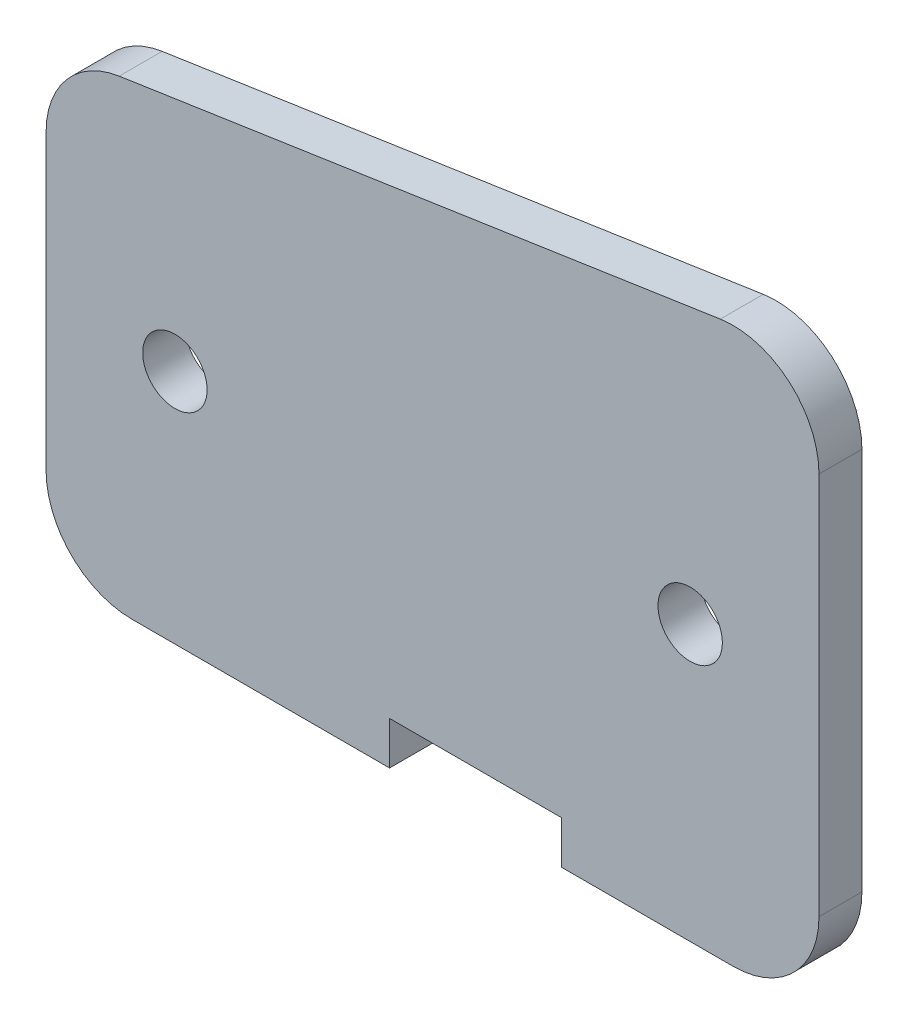
ISO-10303-21;
HEADER;
FILE_DESCRIPTION(('STEP AP214'),'2;1');
FILE_NAME('part.step','',(''),(''),'','','');
FILE_SCHEMA(('AUTOMOTIVE_DESIGN { 1 0 10303 214 1 1 1 1 }'));
ENDSEC;
DATA;
#1=APPLICATION_CONTEXT('core data for automotive mechanical design processes');
#2=APPLICATION_PROTOCOL_DEFINITION('international standard','automotive_design',2000,#1);
#3=PRODUCT_CONTEXT('',#1,'mechanical');
#4=PRODUCT('Part','Part','',(#3));
#5=PRODUCT_RELATED_PRODUCT_CATEGORY('part','',(#4));
#6=PRODUCT_DEFINITION_FORMATION('','',#4);
#7=PRODUCT_DEFINITION_CONTEXT('part definition',#1,'design');
#8=PRODUCT_DEFINITION('design','',#6,#7);
#9=PRODUCT_DEFINITION_SHAPE('','',#8);
#10=(LENGTH_UNIT() NAMED_UNIT(*) SI_UNIT(.MILLI.,.METRE.));
#11=(NAMED_UNIT(*) PLANE_ANGLE_UNIT() SI_UNIT($,.RADIAN.));
#12=(NAMED_UNIT(*) SI_UNIT($,.STERADIAN.) SOLID_ANGLE_UNIT());
#13=UNCERTAINTY_MEASURE_WITH_UNIT(LENGTH_MEASURE(1.E-05),#10,'distance_accuracy_value','');
#14=(GEOMETRIC_REPRESENTATION_CONTEXT(3) GLOBAL_UNCERTAINTY_ASSIGNED_CONTEXT((#13)) GLOBAL_UNIT_ASSIGNED_CONTEXT((#10,
#11,#12)) REPRESENTATION_CONTEXT('',''));
#15=CARTESIAN_POINT('',(0.,0.,0.));
#16=DIRECTION('',(0.,0.,1.));
#17=DIRECTION('',(1.,0.,0.));
#18=AXIS2_PLACEMENT_3D('',#15,#16,#17);
#19=CARTESIAN_POINT('',(-193.675,28.0277098778702,3.175));
#20=DIRECTION('',(0.,0.,-1.));
#21=DIRECTION('',(-1.,0.,0.));
#22=AXIS2_PLACEMENT_3D('',#19,#20,#21);
#23=PLANE('',#22);
#24=CARTESIAN_POINT('',(-193.675,28.0277098778702,3.175));
#25=DIRECTION('',(0.,0.,-1.));
#26=DIRECTION('',(-1.,0.,0.));
#27=AXIS2_PLACEMENT_3D('',#24,#25,#26);
#28=CIRCLE('',#27,6.35);
#29=CARTESIAN_POINT('',(-200.025,28.0277098778702,3.175));
#30=VERTEX_POINT('',#29);
#31=CARTESIAN_POINT('',(-194.616961876107,34.3074557185839,3.175));
#32=VERTEX_POINT('',#31);
#33=EDGE_CURVE('E264',#30,#32,#28,.T.);
#34=ORIENTED_EDGE('',*,*,#33,.F.);
#35=DIRECTION('',(0.,-1.,0.));
#36=VECTOR('',#35,1.);
#37=CARTESIAN_POINT('',(-200.025,28.0277098778702,3.175));
#38=LINE('',#37,#36);
#39=CARTESIAN_POINT('',(-200.025,6.35000000000002,3.175));
#40=VERTEX_POINT('',#39);
#41=EDGE_CURVE('E212',#30,#40,#38,.T.);
#42=ORIENTED_EDGE('',*,*,#41,.T.);
#43=CARTESIAN_POINT('',(-193.675,6.34999999999997,3.175));
#44=DIRECTION('',(0.,0.,1.));
#45=DIRECTION('',(1.,0.,0.));
#46=AXIS2_PLACEMENT_3D('',#43,#44,#45);
#47=CIRCLE('',#46,6.35);
#48=CARTESIAN_POINT('',(-193.675,0.,3.175));
#49=VERTEX_POINT('',#48);
#50=EDGE_CURVE('E206',#40,#49,#47,.T.);
#51=ORIENTED_EDGE('',*,*,#50,.T.);
#52=DIRECTION('',(-1.,0.,0.));
#53=VECTOR('',#52,1.);
#54=CARTESIAN_POINT('',(-174.625,0.,3.175));
#55=LINE('',#54,#53);
#56=CARTESIAN_POINT('',(-174.625,0.,3.175));
#57=VERTEX_POINT('',#56);
#58=EDGE_CURVE('E211',#57,#49,#55,.T.);
#59=ORIENTED_EDGE('',*,*,#58,.F.);
#60=DIRECTION('',(0.,1.,0.));
#61=VECTOR('',#60,1.);
#62=CARTESIAN_POINT('',(-174.625,0.,3.175));
#63=LINE('',#62,#61);
#64=CARTESIAN_POINT('',(-174.625,3.17499999999997,3.175));
#65=VERTEX_POINT('',#64);
#66=EDGE_CURVE('E227',#57,#65,#63,.T.);
#67=ORIENTED_EDGE('',*,*,#66,.T.);
#68=DIRECTION('',(1.,0.,0.));
#69=VECTOR('',#68,1.);
#70=CARTESIAN_POINT('',(-174.625,3.17499999999997,3.175));
#71=LINE('',#70,#69);
#72=CARTESIAN_POINT('',(-161.925,3.17499999999998,3.175));
#73=VERTEX_POINT('',#72);
#74=EDGE_CURVE('E229',#65,#73,#71,.T.);
#75=ORIENTED_EDGE('',*,*,#74,.T.);
#76=DIRECTION('',(0.,1.,0.));
#77=VECTOR('',#76,1.);
#78=CARTESIAN_POINT('',(-161.925,0.,3.175));
#79=LINE('',#78,#77);
#80=CARTESIAN_POINT('',(-161.925,0.,3.175));
#81=VERTEX_POINT('',#80);
#82=EDGE_CURVE('E298',#81,#73,#79,.T.);
#83=ORIENTED_EDGE('',*,*,#82,.F.);
#84=DIRECTION('',(-1.,0.,0.));
#85=VECTOR('',#84,1.);
#86=CARTESIAN_POINT('',(-149.225,0.,3.175));
#87=LINE('',#86,#85);
#88=CARTESIAN_POINT('',(-149.225,0.,3.175));
#89=VERTEX_POINT('',#88);
#90=EDGE_CURVE('E299',#89,#81,#87,.T.);
#91=ORIENTED_EDGE('',*,*,#90,.F.);
#92=CARTESIAN_POINT('',(-149.225,6.34999999999998,3.175));
#93=DIRECTION('',(0.,0.,-1.));
#94=DIRECTION('',(-1.,0.,0.));
#95=AXIS2_PLACEMENT_3D('',#92,#93,#94);
#96=CIRCLE('',#95,6.35);
#97=CARTESIAN_POINT('',(-142.875,6.35000000000002,3.175));
#98=VERTEX_POINT('',#97);
#99=EDGE_CURVE('E304',#98,#89,#96,.T.);
#100=ORIENTED_EDGE('',*,*,#99,.F.);
#101=DIRECTION('',(0.,-1.,0.));
#102=VECTOR('',#101,1.);
#103=CARTESIAN_POINT('',(-142.875,34.6952098778702,3.175));
#104=LINE('',#103,#102);
#105=CARTESIAN_POINT('',(-142.875,34.6952098778702,3.175));
#106=VERTEX_POINT('',#105);
#107=EDGE_CURVE('E307',#106,#98,#104,.T.);
#108=ORIENTED_EDGE('',*,*,#107,.F.);
#109=CARTESIAN_POINT('',(-149.225,34.6952098778702,3.175));
#110=DIRECTION('',(0.,0.,1.));
#111=DIRECTION('',(1.,0.,0.));
#112=AXIS2_PLACEMENT_3D('',#109,#110,#111);
#113=CIRCLE('',#112,6.35);
#114=CARTESIAN_POINT('',(-150.166961876107,40.9749557185839,3.175));
#115=VERTEX_POINT('',#114);
#116=EDGE_CURVE('E310',#106,#115,#113,.T.);
#117=ORIENTED_EDGE('',*,*,#116,.T.);
#118=DIRECTION('',(0.988936352868298,0.148340452930245,0.));
#119=VECTOR('',#118,1.);
#120=CARTESIAN_POINT('',(-194.616961876107,34.3074557185839,3.175));
#121=LINE('',#120,#119);
#122=EDGE_CURVE('E312',#32,#115,#121,.T.);
#123=ORIENTED_EDGE('',*,*,#122,.F.);
#124=EDGE_LOOP('',(#34,#42,#51,#59,#67,#75,#83,#91,#100,#108,#117,#123));
#125=FACE_BOUND('',#124,.T.);
#126=CARTESIAN_POINT('',(-152.4,20.3199999999996,3.175));
#127=DIRECTION('',(0.,0.,1.));
#128=DIRECTION('',(1.,0.,0.));
#129=AXIS2_PLACEMENT_3D('',#126,#127,#128);
#130=CIRCLE('',#129,2.38125000000001);
#131=CARTESIAN_POINT('',(-150.01875,20.3199999999996,3.175));
#132=VERTEX_POINT('',#131);
#133=EDGE_CURVE('E238',#132,#132,#130,.T.);
#134=ORIENTED_EDGE('',*,*,#133,.F.);
#135=EDGE_LOOP('',(#134));
#136=FACE_BOUND('',#135,.T.);
#137=CARTESIAN_POINT('',(-190.5,17.4624999999994,3.175));
#138=DIRECTION('',(0.,0.,1.));
#139=DIRECTION('',(1.,0.,0.));
#140=AXIS2_PLACEMENT_3D('',#137,#138,#139);
#141=CIRCLE('',#140,2.38125000000001);
#142=CARTESIAN_POINT('',(-188.11875,17.4624999999994,3.175));
#143=VERTEX_POINT('',#142);
#144=EDGE_CURVE('E318',#143,#143,#141,.T.);
#145=ORIENTED_EDGE('',*,*,#144,.F.);
#146=EDGE_LOOP('',(#145));
#147=FACE_BOUND('',#146,.T.);
#148=ADVANCED_FACE('F111',(#125,#136,#147),#23,.F.);
#149=CARTESIAN_POINT('',(-193.675,28.0277098778702,0.));
#150=DIRECTION('',(0.,0.,-1.));
#151=DIRECTION('',(-1.,0.,0.));
#152=AXIS2_PLACEMENT_3D('',#149,#150,#151);
#153=PLANE('',#152);
#154=CARTESIAN_POINT('',(-152.4,20.3199999999996,0.));
#155=DIRECTION('',(0.,0.,1.));
#156=DIRECTION('',(1.,0.,0.));
#157=AXIS2_PLACEMENT_3D('',#154,#155,#156);
#158=CIRCLE('',#157,2.38125000000001);
#159=CARTESIAN_POINT('',(-150.01875,20.3199999999996,0.));
#160=VERTEX_POINT('',#159);
#161=EDGE_CURVE('E315',#160,#160,#158,.T.);
#162=ORIENTED_EDGE('',*,*,#161,.T.);
#163=EDGE_LOOP('',(#162));
#164=FACE_BOUND('',#163,.T.);
#165=CARTESIAN_POINT('',(-193.675,28.0277098778702,0.));
#166=DIRECTION('',(0.,0.,-1.));
#167=DIRECTION('',(-1.,0.,0.));
#168=AXIS2_PLACEMENT_3D('',#165,#166,#167);
#169=CIRCLE('',#168,6.35);
#170=CARTESIAN_POINT('',(-200.025,28.0277098778702,0.));
#171=VERTEX_POINT('',#170);
#172=CARTESIAN_POINT('',(-194.616961876107,34.3074557185839,0.));
#173=VERTEX_POINT('',#172);
#174=EDGE_CURVE('E234',#171,#173,#169,.T.);
#175=ORIENTED_EDGE('',*,*,#174,.T.);
#176=DIRECTION('',(0.988936352868298,0.148340452930245,0.));
#177=VECTOR('',#176,1.);
#178=CARTESIAN_POINT('',(-194.616961876107,34.3074557185839,0.));
#179=LINE('',#178,#177);
#180=CARTESIAN_POINT('',(-150.166961876107,40.9749557185839,0.));
#181=VERTEX_POINT('',#180);
#182=EDGE_CURVE('E237',#173,#181,#179,.T.);
#183=ORIENTED_EDGE('',*,*,#182,.T.);
#184=CARTESIAN_POINT('',(-149.225,34.6952098778702,0.));
#185=DIRECTION('',(0.,0.,1.));
#186=DIRECTION('',(1.,0.,0.));
#187=AXIS2_PLACEMENT_3D('',#184,#185,#186);
#188=CIRCLE('',#187,6.35);
#189=CARTESIAN_POINT('',(-142.875,34.6952098778702,0.));
#190=VERTEX_POINT('',#189);
#191=EDGE_CURVE('E241',#190,#181,#188,.T.);
#192=ORIENTED_EDGE('',*,*,#191,.F.);
#193=DIRECTION('',(0.,-1.,0.));
#194=VECTOR('',#193,1.);
#195=CARTESIAN_POINT('',(-142.875,34.6952098778702,0.));
#196=LINE('',#195,#194);
#197=CARTESIAN_POINT('',(-142.875,6.35000000000002,0.));
#198=VERTEX_POINT('',#197);
#199=EDGE_CURVE('E244',#190,#198,#196,.T.);
#200=ORIENTED_EDGE('',*,*,#199,.T.);
#201=CARTESIAN_POINT('',(-149.225,6.34999999999998,0.));
#202=DIRECTION('',(0.,0.,-1.));
#203=DIRECTION('',(-1.,0.,0.));
#204=AXIS2_PLACEMENT_3D('',#201,#202,#203);
#205=CIRCLE('',#204,6.35);
#206=CARTESIAN_POINT('',(-149.225,0.,0.));
#207=VERTEX_POINT('',#206);
#208=EDGE_CURVE('E247',#198,#207,#205,.T.);
#209=ORIENTED_EDGE('',*,*,#208,.T.);
#210=DIRECTION('',(-1.,0.,0.));
#211=VECTOR('',#210,1.);
#212=CARTESIAN_POINT('',(-149.225,0.,0.));
#213=LINE('',#212,#211);
#214=CARTESIAN_POINT('',(-161.925,0.,0.));
#215=VERTEX_POINT('',#214);
#216=EDGE_CURVE('E250',#207,#215,#213,.T.);
#217=ORIENTED_EDGE('',*,*,#216,.T.);
#218=DIRECTION('',(0.,1.,0.));
#219=VECTOR('',#218,1.);
#220=CARTESIAN_POINT('',(-161.925,0.,0.));
#221=LINE('',#220,#219);
#222=CARTESIAN_POINT('',(-161.925,3.17499999999998,0.));
#223=VERTEX_POINT('',#222);
#224=EDGE_CURVE('E253',#215,#223,#221,.T.);
#225=ORIENTED_EDGE('',*,*,#224,.T.);
#226=DIRECTION('',(1.,0.,0.));
#227=VECTOR('',#226,1.);
#228=CARTESIAN_POINT('',(-174.625,3.17499999999997,0.));
#229=LINE('',#228,#227);
#230=CARTESIAN_POINT('',(-174.625,3.17499999999997,0.));
#231=VERTEX_POINT('',#230);
#232=EDGE_CURVE('E256',#231,#223,#229,.T.);
#233=ORIENTED_EDGE('',*,*,#232,.F.);
#234=DIRECTION('',(0.,1.,0.));
#235=VECTOR('',#234,1.);
#236=CARTESIAN_POINT('',(-174.625,0.,0.));
#237=LINE('',#236,#235);
#238=CARTESIAN_POINT('',(-174.625,0.,0.));
#239=VERTEX_POINT('',#238);
#240=EDGE_CURVE('E259',#239,#231,#237,.T.);
#241=ORIENTED_EDGE('',*,*,#240,.F.);
#242=DIRECTION('',(-1.,0.,0.));
#243=VECTOR('',#242,1.);
#244=CARTESIAN_POINT('',(-174.625,0.,0.));
#245=LINE('',#244,#243);
#246=CARTESIAN_POINT('',(-193.675,0.,0.));
#247=VERTEX_POINT('',#246);
#248=EDGE_CURVE('E261',#239,#247,#245,.T.);
#249=ORIENTED_EDGE('',*,*,#248,.T.);
#250=CARTESIAN_POINT('',(-193.675,6.34999999999997,0.));
#251=DIRECTION('',(0.,0.,1.));
#252=DIRECTION('',(1.,0.,0.));
#253=AXIS2_PLACEMENT_3D('',#250,#251,#252);
#254=CIRCLE('',#253,6.35);
#255=CARTESIAN_POINT('',(-200.025,6.35000000000002,0.));
#256=VERTEX_POINT('',#255);
#257=EDGE_CURVE('E219',#256,#247,#254,.T.);
#258=ORIENTED_EDGE('',*,*,#257,.F.);
#259=DIRECTION('',(0.,-1.,0.));
#260=VECTOR('',#259,1.);
#261=CARTESIAN_POINT('',(-200.025,28.0277098778702,0.));
#262=LINE('',#261,#260);
#263=EDGE_CURVE('E169',#171,#256,#262,.T.);
#264=ORIENTED_EDGE('',*,*,#263,.F.);
#265=EDGE_LOOP('',(#175,#183,#192,#200,#209,#217,#225,#233,#241,#249,#258,#264));
#266=FACE_BOUND('',#265,.T.);
#267=CARTESIAN_POINT('',(-190.5,17.4624999999994,0.));
#268=DIRECTION('',(0.,0.,1.));
#269=DIRECTION('',(1.,0.,0.));
#270=AXIS2_PLACEMENT_3D('',#267,#268,#269);
#271=CIRCLE('',#270,2.38125000000001);
#272=CARTESIAN_POINT('',(-188.11875,17.4624999999994,0.));
#273=VERTEX_POINT('',#272);
#274=EDGE_CURVE('E321',#273,#273,#271,.T.);
#275=ORIENTED_EDGE('',*,*,#274,.T.);
#276=EDGE_LOOP('',(#275));
#277=FACE_BOUND('',#276,.T.);
#278=ADVANCED_FACE('F285',(#164,#266,#277),#153,.T.);
#279=CARTESIAN_POINT('',(-193.675,28.0277098778702,3.175));
#280=DIRECTION('',(0.,0.,-1.));
#281=DIRECTION('',(-1.,0.,0.));
#282=AXIS2_PLACEMENT_3D('',#279,#280,#281);
#283=CYLINDRICAL_SURFACE('',#282,6.35);
#284=ORIENTED_EDGE('',*,*,#174,.F.);
#285=DIRECTION('',(0.,0.,-1.));
#286=VECTOR('',#285,1.);
#287=CARTESIAN_POINT('',(-200.025,28.0277098778702,3.175));
#288=LINE('',#287,#286);
#289=EDGE_CURVE('E12',#30,#171,#288,.T.);
#290=ORIENTED_EDGE('',*,*,#289,.F.);
#291=ORIENTED_EDGE('',*,*,#33,.T.);
#292=DIRECTION('',(0.,0.,-1.));
#293=VECTOR('',#292,1.);
#294=CARTESIAN_POINT('',(-194.616961876107,34.3074557185839,3.175));
#295=LINE('',#294,#293);
#296=EDGE_CURVE('E115',#32,#173,#295,.T.);
#297=ORIENTED_EDGE('',*,*,#296,.T.);
#298=EDGE_LOOP('',(#284,#290,#291,#297));
#299=FACE_BOUND('',#298,.T.);
#300=ADVANCED_FACE('F113',(#299),#283,.T.);
#301=CARTESIAN_POINT('',(-200.025,28.0277098778702,3.175));
#302=DIRECTION('',(1.,0.,0.));
#303=DIRECTION('',(0.,0.,-1.));
#304=AXIS2_PLACEMENT_3D('',#301,#302,#303);
#305=PLANE('',#304);
#306=ORIENTED_EDGE('',*,*,#263,.T.);
#307=DIRECTION('',(0.,0.,-1.));
#308=VECTOR('',#307,1.);
#309=CARTESIAN_POINT('',(-200.025,6.35000000000002,3.175));
#310=LINE('',#309,#308);
#311=EDGE_CURVE('E121',#40,#256,#310,.T.);
#312=ORIENTED_EDGE('',*,*,#311,.F.);
#313=ORIENTED_EDGE('',*,*,#41,.F.);
#314=ORIENTED_EDGE('',*,*,#289,.T.);
#315=EDGE_LOOP('',(#306,#312,#313,#314));
#316=FACE_BOUND('',#315,.T.);
#317=ADVANCED_FACE('F341',(#316),#305,.F.);
#318=CARTESIAN_POINT('',(-193.675,6.34999999999997,3.175));
#319=DIRECTION('',(0.,0.,-1.));
#320=DIRECTION('',(-1.,0.,0.));
#321=AXIS2_PLACEMENT_3D('',#318,#319,#320);
#322=CYLINDRICAL_SURFACE('',#321,6.35);
#323=ORIENTED_EDGE('',*,*,#257,.T.);
#324=DIRECTION('',(0.,0.,-1.));
#325=VECTOR('',#324,1.);
#326=CARTESIAN_POINT('',(-193.675,0.,3.175));
#327=LINE('',#326,#325);
#328=EDGE_CURVE('E216',#49,#247,#327,.T.);
#329=ORIENTED_EDGE('',*,*,#328,.F.);
#330=ORIENTED_EDGE('',*,*,#50,.F.);
#331=ORIENTED_EDGE('',*,*,#311,.T.);
#332=EDGE_LOOP('',(#323,#329,#330,#331));
#333=FACE_BOUND('',#332,.T.);
#334=ADVANCED_FACE('F217',(#333),#322,.T.);
#335=CARTESIAN_POINT('',(-174.625,0.,3.175));
#336=DIRECTION('',(0.,-1.,0.));
#337=DIRECTION('',(1.,0.,0.));
#338=AXIS2_PLACEMENT_3D('',#335,#336,#337);
#339=PLANE('',#338);
#340=ORIENTED_EDGE('',*,*,#248,.F.);
#341=DIRECTION('',(0.,0.,-1.));
#342=VECTOR('',#341,1.);
#343=CARTESIAN_POINT('',(-174.625,0.,3.175));
#344=LINE('',#343,#342);
#345=EDGE_CURVE('E223',#57,#239,#344,.T.);
#346=ORIENTED_EDGE('',*,*,#345,.F.);
#347=ORIENTED_EDGE('',*,*,#58,.T.);
#348=ORIENTED_EDGE('',*,*,#328,.T.);
#349=EDGE_LOOP('',(#340,#346,#347,#348));
#350=FACE_BOUND('',#349,.T.);
#351=ADVANCED_FACE('F225',(#350),#339,.T.);
#352=CARTESIAN_POINT('',(-174.625,0.,3.175));
#353=DIRECTION('',(-1.,0.,0.));
#354=DIRECTION('',(0.,0.,1.));
#355=AXIS2_PLACEMENT_3D('',#352,#353,#354);
#356=PLANE('',#355);
#357=ORIENTED_EDGE('',*,*,#240,.T.);
#358=DIRECTION('',(0.,0.,-1.));
#359=VECTOR('',#358,1.);
#360=CARTESIAN_POINT('',(-174.625,3.17499999999997,3.175));
#361=LINE('',#360,#359);
#362=EDGE_CURVE('E268',#65,#231,#361,.T.);
#363=ORIENTED_EDGE('',*,*,#362,.F.);
#364=ORIENTED_EDGE('',*,*,#66,.F.);
#365=ORIENTED_EDGE('',*,*,#345,.T.);
#366=EDGE_LOOP('',(#357,#363,#364,#365));
#367=FACE_BOUND('',#366,.T.);
#368=ADVANCED_FACE('F291',(#367),#356,.F.);
#369=CARTESIAN_POINT('',(-174.625,3.17499999999997,3.175));
#370=DIRECTION('',(0.,1.,0.));
#371=DIRECTION('',(-1.,0.,0.));
#372=AXIS2_PLACEMENT_3D('',#369,#370,#371);
#373=PLANE('',#372);
#374=ORIENTED_EDGE('',*,*,#232,.T.);
#375=DIRECTION('',(0.,0.,-1.));
#376=VECTOR('',#375,1.);
#377=CARTESIAN_POINT('',(-161.925,3.17499999999998,3.175));
#378=LINE('',#377,#376);
#379=EDGE_CURVE('E271',#73,#223,#378,.T.);
#380=ORIENTED_EDGE('',*,*,#379,.F.);
#381=ORIENTED_EDGE('',*,*,#74,.F.);
#382=ORIENTED_EDGE('',*,*,#362,.T.);
#383=EDGE_LOOP('',(#374,#380,#381,#382));
#384=FACE_BOUND('',#383,.T.);
#385=ADVANCED_FACE('F294',(#384),#373,.F.);
#386=CARTESIAN_POINT('',(-161.925,0.,3.175));
#387=DIRECTION('',(-1.,0.,0.));
#388=DIRECTION('',(0.,0.,1.));
#389=AXIS2_PLACEMENT_3D('',#386,#387,#388);
#390=PLANE('',#389);
#391=ORIENTED_EDGE('',*,*,#224,.F.);
#392=DIRECTION('',(0.,0.,-1.));
#393=VECTOR('',#392,1.);
#394=CARTESIAN_POINT('',(-161.925,0.,3.175));
#395=LINE('',#394,#393);
#396=EDGE_CURVE('E273',#81,#215,#395,.T.);
#397=ORIENTED_EDGE('',*,*,#396,.F.);
#398=ORIENTED_EDGE('',*,*,#82,.T.);
#399=ORIENTED_EDGE('',*,*,#379,.T.);
#400=EDGE_LOOP('',(#391,#397,#398,#399));
#401=FACE_BOUND('',#400,.T.);
#402=ADVANCED_FACE('F352',(#401),#390,.T.);
#403=CARTESIAN_POINT('',(-149.225,0.,3.175));
#404=DIRECTION('',(0.,-1.,0.));
#405=DIRECTION('',(1.,0.,0.));
#406=AXIS2_PLACEMENT_3D('',#403,#404,#405);
#407=PLANE('',#406);
#408=ORIENTED_EDGE('',*,*,#216,.F.);
#409=DIRECTION('',(0.,0.,-1.));
#410=VECTOR('',#409,1.);
#411=CARTESIAN_POINT('',(-149.225,0.,3.175));
#412=LINE('',#411,#410);
#413=EDGE_CURVE('E275',#89,#207,#412,.T.);
#414=ORIENTED_EDGE('',*,*,#413,.F.);
#415=ORIENTED_EDGE('',*,*,#90,.T.);
#416=ORIENTED_EDGE('',*,*,#396,.T.);
#417=EDGE_LOOP('',(#408,#414,#415,#416));
#418=FACE_BOUND('',#417,.T.);
#419=ADVANCED_FACE('F355',(#418),#407,.T.);
#420=CARTESIAN_POINT('',(-149.225,6.34999999999998,3.175));
#421=DIRECTION('',(0.,0.,-1.));
#422=DIRECTION('',(-1.,0.,0.));
#423=AXIS2_PLACEMENT_3D('',#420,#421,#422);
#424=CYLINDRICAL_SURFACE('',#423,6.35);
#425=ORIENTED_EDGE('',*,*,#208,.F.);
#426=DIRECTION('',(0.,0.,-1.));
#427=VECTOR('',#426,1.);
#428=CARTESIAN_POINT('',(-142.875,6.35000000000002,3.175));
#429=LINE('',#428,#427);
#430=EDGE_CURVE('E277',#98,#198,#429,.T.);
#431=ORIENTED_EDGE('',*,*,#430,.F.);
#432=ORIENTED_EDGE('',*,*,#99,.T.);
#433=ORIENTED_EDGE('',*,*,#413,.T.);
#434=EDGE_LOOP('',(#425,#431,#432,#433));
#435=FACE_BOUND('',#434,.T.);
#436=ADVANCED_FACE('F359',(#435),#424,.T.);
#437=CARTESIAN_POINT('',(-142.875,34.6952098778702,3.175));
#438=DIRECTION('',(1.,0.,0.));
#439=DIRECTION('',(0.,0.,-1.));
#440=AXIS2_PLACEMENT_3D('',#437,#438,#439);
#441=PLANE('',#440);
#442=ORIENTED_EDGE('',*,*,#199,.F.);
#443=DIRECTION('',(0.,0.,-1.));
#444=VECTOR('',#443,1.);
#445=CARTESIAN_POINT('',(-142.875,34.6952098778702,3.175));
#446=LINE('',#445,#444);
#447=EDGE_CURVE('E279',#106,#190,#446,.T.);
#448=ORIENTED_EDGE('',*,*,#447,.F.);
#449=ORIENTED_EDGE('',*,*,#107,.T.);
#450=ORIENTED_EDGE('',*,*,#430,.T.);
#451=EDGE_LOOP('',(#442,#448,#449,#450));
#452=FACE_BOUND('',#451,.T.);
#453=ADVANCED_FACE('F363',(#452),#441,.T.);
#454=CARTESIAN_POINT('',(-149.225,34.6952098778702,3.175));
#455=DIRECTION('',(0.,0.,-1.));
#456=DIRECTION('',(-1.,0.,0.));
#457=AXIS2_PLACEMENT_3D('',#454,#455,#456);
#458=CYLINDRICAL_SURFACE('',#457,6.35);
#459=ORIENTED_EDGE('',*,*,#191,.T.);
#460=DIRECTION('',(0.,0.,-1.));
#461=VECTOR('',#460,1.);
#462=CARTESIAN_POINT('',(-150.166961876107,40.9749557185839,3.175));
#463=LINE('',#462,#461);
#464=EDGE_CURVE('E280',#115,#181,#463,.T.);
#465=ORIENTED_EDGE('',*,*,#464,.F.);
#466=ORIENTED_EDGE('',*,*,#116,.F.);
#467=ORIENTED_EDGE('',*,*,#447,.T.);
#468=EDGE_LOOP('',(#459,#465,#466,#467));
#469=FACE_BOUND('',#468,.T.);
#470=ADVANCED_FACE('F367',(#469),#458,.T.);
#471=CARTESIAN_POINT('',(-194.616961876107,34.3074557185839,3.175));
#472=DIRECTION('',(-0.148340452930245,0.988936352868297,0.));
#473=DIRECTION('',(-0.988936352868298,-0.148340452930245,0.));
#474=AXIS2_PLACEMENT_3D('',#471,#472,#473);
#475=PLANE('',#474);
#476=ORIENTED_EDGE('',*,*,#182,.F.);
#477=ORIENTED_EDGE('',*,*,#296,.F.);
#478=ORIENTED_EDGE('',*,*,#122,.T.);
#479=ORIENTED_EDGE('',*,*,#464,.T.);
#480=EDGE_LOOP('',(#476,#477,#478,#479));
#481=FACE_BOUND('',#480,.T.);
#482=ADVANCED_FACE('F282',(#481),#475,.T.);
#483=CARTESIAN_POINT('',(-152.4,20.3199999999996,3.175));
#484=DIRECTION('',(0.,0.,-1.));
#485=DIRECTION('',(-1.,0.,0.));
#486=AXIS2_PLACEMENT_3D('',#483,#484,#485);
#487=CYLINDRICAL_SURFACE('',#486,2.38125000000001);
#488=ORIENTED_EDGE('',*,*,#133,.T.);
#489=EDGE_LOOP('',(#488));
#490=FACE_BOUND('',#489,.T.);
#491=ORIENTED_EDGE('',*,*,#161,.F.);
#492=EDGE_LOOP('',(#491));
#493=FACE_BOUND('',#492,.T.);
#494=ADVANCED_FACE('F338',(#490,#493),#487,.F.);
#495=CARTESIAN_POINT('',(-190.5,17.4624999999994,3.175));
#496=DIRECTION('',(0.,0.,-1.));
#497=DIRECTION('',(-1.,0.,0.));
#498=AXIS2_PLACEMENT_3D('',#495,#496,#497);
#499=CYLINDRICAL_SURFACE('',#498,2.38125000000001);
#500=ORIENTED_EDGE('',*,*,#144,.T.);
#501=EDGE_LOOP('',(#500));
#502=FACE_BOUND('',#501,.T.);
#503=ORIENTED_EDGE('',*,*,#274,.F.);
#504=EDGE_LOOP('',(#503));
#505=FACE_BOUND('',#504,.T.);
#506=ADVANCED_FACE('F327',(#502,#505),#499,.F.);
#507=CLOSED_SHELL('',(#148,#278,#300,#317,#334,#351,#368,#385,#402,#419,#436,#453,#470,#482,
#494,#506));
#508=MANIFOLD_SOLID_BREP('B2',#507);
#509=ADVANCED_BREP_SHAPE_REPRESENTATION('',(#18,#508),#14);
#510=SHAPE_DEFINITION_REPRESENTATION(#9,#509);
ENDSEC;
END-ISO-10303-21;
